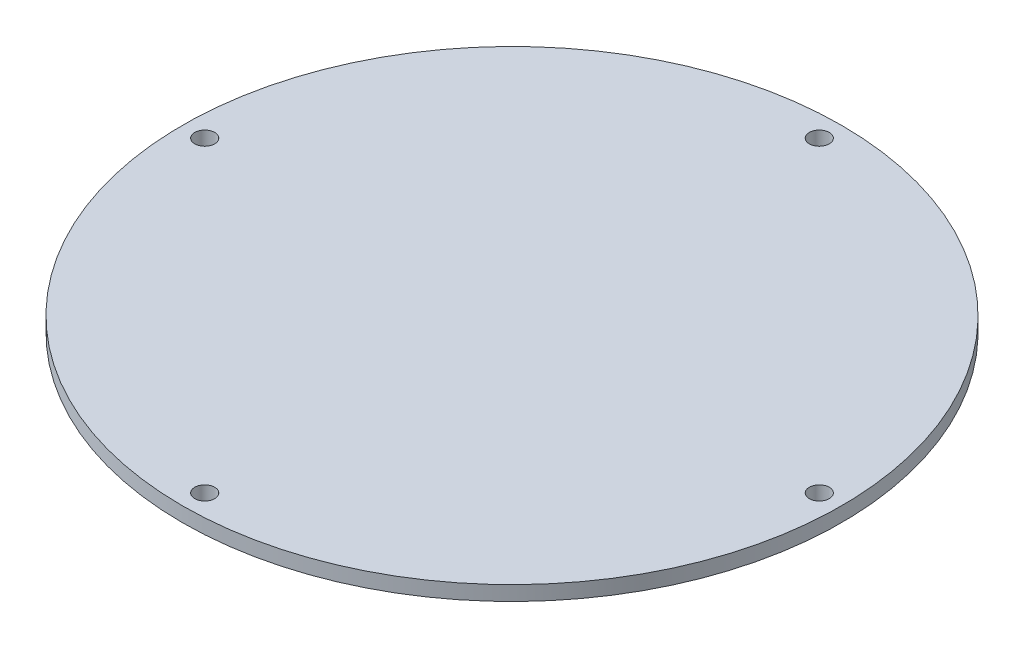
ISO-10303-21;
HEADER;
FILE_DESCRIPTION(('STEP AP214'),'2;1');
FILE_NAME('part.step','',(''),(''),'','','');
FILE_SCHEMA(('AUTOMOTIVE_DESIGN { 1 0 10303 214 1 1 1 1 }'));
ENDSEC;
DATA;
#1=APPLICATION_CONTEXT('core data for automotive mechanical design processes');
#2=APPLICATION_PROTOCOL_DEFINITION('international standard','automotive_design',2000,#1);
#3=PRODUCT_CONTEXT('',#1,'mechanical');
#4=PRODUCT('Part','Part','',(#3));
#5=PRODUCT_RELATED_PRODUCT_CATEGORY('part','',(#4));
#6=PRODUCT_DEFINITION_FORMATION('','',#4);
#7=PRODUCT_DEFINITION_CONTEXT('part definition',#1,'design');
#8=PRODUCT_DEFINITION('design','',#6,#7);
#9=PRODUCT_DEFINITION_SHAPE('','',#8);
#10=(LENGTH_UNIT() NAMED_UNIT(*) SI_UNIT(.MILLI.,.METRE.));
#11=(NAMED_UNIT(*) PLANE_ANGLE_UNIT() SI_UNIT($,.RADIAN.));
#12=(NAMED_UNIT(*) SI_UNIT($,.STERADIAN.) SOLID_ANGLE_UNIT());
#13=UNCERTAINTY_MEASURE_WITH_UNIT(LENGTH_MEASURE(1.E-05),#10,'distance_accuracy_value','');
#14=(GEOMETRIC_REPRESENTATION_CONTEXT(3) GLOBAL_UNCERTAINTY_ASSIGNED_CONTEXT((#13)) GLOBAL_UNIT_ASSIGNED_CONTEXT((#10,
#11,#12)) REPRESENTATION_CONTEXT('',''));
#15=CARTESIAN_POINT('',(0.,0.,0.));
#16=DIRECTION('',(0.,0.,1.));
#17=DIRECTION('',(1.,0.,0.));
#18=AXIS2_PLACEMENT_3D('',#15,#16,#17);
#19=CARTESIAN_POINT('',(0.,2.54,0.));
#20=DIRECTION('',(0.,-1.,0.));
#21=DIRECTION('',(0.,0.,-1.));
#22=AXIS2_PLACEMENT_3D('',#19,#20,#21);
#23=CYLINDRICAL_SURFACE('',#22,57.15);
#24=CARTESIAN_POINT('',(0.,2.54,0.));
#25=DIRECTION('',(0.,1.,0.));
#26=DIRECTION('',(0.,0.,1.));
#27=AXIS2_PLACEMENT_3D('',#24,#25,#26);
#28=CIRCLE('',#27,57.15);
#29=CARTESIAN_POINT('',(0.,2.54,57.15));
#30=VERTEX_POINT('',#29);
#31=EDGE_CURVE('E10',#30,#30,#28,.T.);
#32=ORIENTED_EDGE('',*,*,#31,.F.);
#33=EDGE_LOOP('',(#32));
#34=FACE_BOUND('',#33,.T.);
#35=CARTESIAN_POINT('',(0.,0.,0.));
#36=DIRECTION('',(0.,1.,0.));
#37=DIRECTION('',(0.,0.,1.));
#38=AXIS2_PLACEMENT_3D('',#35,#36,#37);
#39=CIRCLE('',#38,57.15);
#40=CARTESIAN_POINT('',(0.,0.,57.15));
#41=VERTEX_POINT('',#40);
#42=EDGE_CURVE('E54',#41,#41,#39,.T.);
#43=ORIENTED_EDGE('',*,*,#42,.T.);
#44=EDGE_LOOP('',(#43));
#45=FACE_BOUND('',#44,.T.);
#46=ADVANCED_FACE('F51',(#34,#45),#23,.T.);
#47=CARTESIAN_POINT('',(0.,2.54,0.));
#48=DIRECTION('',(0.,1.,0.));
#49=DIRECTION('',(0.,0.,1.));
#50=AXIS2_PLACEMENT_3D('',#47,#48,#49);
#51=PLANE('',#50);
#52=CARTESIAN_POINT('',(-5.58143949626649E-13,2.54,-53.286260229742));
#53=DIRECTION('',(0.,1.,0.));
#54=DIRECTION('',(0.,0.,1.));
#55=AXIS2_PLACEMENT_3D('',#52,#53,#54);
#56=CIRCLE('',#55,1.72719999999999);
#57=CARTESIAN_POINT('',(-5.58143949626649E-13,2.54,-51.559060229742));
#58=VERTEX_POINT('',#57);
#59=EDGE_CURVE('E83',#58,#58,#56,.T.);
#60=ORIENTED_EDGE('',*,*,#59,.F.);
#61=EDGE_LOOP('',(#60));
#62=FACE_BOUND('',#61,.T.);
#63=CARTESIAN_POINT('',(53.286260229742,2.54,0.));
#64=DIRECTION('',(0.,1.,0.));
#65=DIRECTION('',(0.,0.,1.));
#66=AXIS2_PLACEMENT_3D('',#63,#64,#65);
#67=CIRCLE('',#66,1.72719999999999);
#68=CARTESIAN_POINT('',(53.286260229742,2.54,1.72719999999999));
#69=VERTEX_POINT('',#68);
#70=EDGE_CURVE('E77',#69,#69,#67,.T.);
#71=ORIENTED_EDGE('',*,*,#70,.F.);
#72=EDGE_LOOP('',(#71));
#73=FACE_BOUND('',#72,.T.);
#74=CARTESIAN_POINT('',(1.86047983208883E-13,2.54,53.286260229742));
#75=DIRECTION('',(0.,1.,0.));
#76=DIRECTION('',(0.,0.,1.));
#77=AXIS2_PLACEMENT_3D('',#74,#75,#76);
#78=CIRCLE('',#77,1.72719999999999);
#79=CARTESIAN_POINT('',(1.86047983208883E-13,2.54,55.0134602297419));
#80=VERTEX_POINT('',#79);
#81=EDGE_CURVE('E71',#80,#80,#78,.T.);
#82=ORIENTED_EDGE('',*,*,#81,.F.);
#83=EDGE_LOOP('',(#82));
#84=FACE_BOUND('',#83,.T.);
#85=CARTESIAN_POINT('',(-53.286260229742,2.54,0.));
#86=DIRECTION('',(0.,1.,0.));
#87=DIRECTION('',(0.,0.,1.));
#88=AXIS2_PLACEMENT_3D('',#85,#86,#87);
#89=CIRCLE('',#88,1.72719999999999);
#90=CARTESIAN_POINT('',(-53.286260229742,2.54,1.72719999999999));
#91=VERTEX_POINT('',#90);
#92=EDGE_CURVE('E65',#91,#91,#89,.T.);
#93=ORIENTED_EDGE('',*,*,#92,.F.);
#94=EDGE_LOOP('',(#93));
#95=FACE_BOUND('',#94,.T.);
#96=ORIENTED_EDGE('',*,*,#31,.T.);
#97=EDGE_LOOP('',(#96));
#98=FACE_BOUND('',#97,.T.);
#99=ADVANCED_FACE('F89',(#62,#73,#84,#95,#98),#51,.T.);
#100=CARTESIAN_POINT('',(0.,0.,0.));
#101=DIRECTION('',(0.,1.,0.));
#102=DIRECTION('',(0.,0.,1.));
#103=AXIS2_PLACEMENT_3D('',#100,#101,#102);
#104=PLANE('',#103);
#105=CARTESIAN_POINT('',(-5.58143949626649E-13,0.,-53.286260229742));
#106=DIRECTION('',(0.,1.,0.));
#107=DIRECTION('',(0.,0.,1.));
#108=AXIS2_PLACEMENT_3D('',#105,#106,#107);
#109=CIRCLE('',#108,1.7272);
#110=CARTESIAN_POINT('',(-5.58143949626649E-13,0.,-51.559060229742));
#111=VERTEX_POINT('',#110);
#112=EDGE_CURVE('E80',#111,#111,#109,.T.);
#113=ORIENTED_EDGE('',*,*,#112,.T.);
#114=EDGE_LOOP('',(#113));
#115=FACE_BOUND('',#114,.T.);
#116=CARTESIAN_POINT('',(53.286260229742,0.,0.));
#117=DIRECTION('',(0.,1.,0.));
#118=DIRECTION('',(0.,0.,1.));
#119=AXIS2_PLACEMENT_3D('',#116,#117,#118);
#120=CIRCLE('',#119,1.7272);
#121=CARTESIAN_POINT('',(53.286260229742,0.,1.7272));
#122=VERTEX_POINT('',#121);
#123=EDGE_CURVE('E74',#122,#122,#120,.T.);
#124=ORIENTED_EDGE('',*,*,#123,.T.);
#125=EDGE_LOOP('',(#124));
#126=FACE_BOUND('',#125,.T.);
#127=CARTESIAN_POINT('',(1.86047983208883E-13,0.,53.286260229742));
#128=DIRECTION('',(0.,1.,0.));
#129=DIRECTION('',(0.,0.,1.));
#130=AXIS2_PLACEMENT_3D('',#127,#128,#129);
#131=CIRCLE('',#130,1.7272);
#132=CARTESIAN_POINT('',(1.86047983208883E-13,0.,55.013460229742));
#133=VERTEX_POINT('',#132);
#134=EDGE_CURVE('E68',#133,#133,#131,.T.);
#135=ORIENTED_EDGE('',*,*,#134,.T.);
#136=EDGE_LOOP('',(#135));
#137=FACE_BOUND('',#136,.T.);
#138=CARTESIAN_POINT('',(-53.286260229742,0.,0.));
#139=DIRECTION('',(0.,1.,0.));
#140=DIRECTION('',(0.,0.,1.));
#141=AXIS2_PLACEMENT_3D('',#138,#139,#140);
#142=CIRCLE('',#141,1.7272);
#143=CARTESIAN_POINT('',(-53.286260229742,0.,1.7272));
#144=VERTEX_POINT('',#143);
#145=EDGE_CURVE('E61',#144,#144,#142,.T.);
#146=ORIENTED_EDGE('',*,*,#145,.T.);
#147=EDGE_LOOP('',(#146));
#148=FACE_BOUND('',#147,.T.);
#149=ORIENTED_EDGE('',*,*,#42,.F.);
#150=EDGE_LOOP('',(#149));
#151=FACE_BOUND('',#150,.T.);
#152=ADVANCED_FACE('F92',(#115,#126,#137,#148,#151),#104,.F.);
#153=CARTESIAN_POINT('',(-53.286260229742,2.54,0.));
#154=DIRECTION('',(0.,1.,0.));
#155=DIRECTION('',(0.,0.,1.));
#156=AXIS2_PLACEMENT_3D('',#153,#154,#155);
#157=CYLINDRICAL_SURFACE('',#156,1.72719999999999);
#158=ORIENTED_EDGE('',*,*,#145,.F.);
#159=EDGE_LOOP('',(#158));
#160=FACE_BOUND('',#159,.T.);
#161=ORIENTED_EDGE('',*,*,#92,.T.);
#162=EDGE_LOOP('',(#161));
#163=FACE_BOUND('',#162,.T.);
#164=ADVANCED_FACE('F100',(#160,#163),#157,.F.);
#165=CARTESIAN_POINT('',(1.86047983208883E-13,2.54,53.286260229742));
#166=DIRECTION('',(0.,1.,0.));
#167=DIRECTION('',(0.,0.,1.));
#168=AXIS2_PLACEMENT_3D('',#165,#166,#167);
#169=CYLINDRICAL_SURFACE('',#168,1.72719999999999);
#170=ORIENTED_EDGE('',*,*,#134,.F.);
#171=EDGE_LOOP('',(#170));
#172=FACE_BOUND('',#171,.T.);
#173=ORIENTED_EDGE('',*,*,#81,.T.);
#174=EDGE_LOOP('',(#173));
#175=FACE_BOUND('',#174,.T.);
#176=ADVANCED_FACE('F102',(#172,#175),#169,.F.);
#177=CARTESIAN_POINT('',(53.286260229742,2.54,0.));
#178=DIRECTION('',(0.,1.,0.));
#179=DIRECTION('',(0.,0.,1.));
#180=AXIS2_PLACEMENT_3D('',#177,#178,#179);
#181=CYLINDRICAL_SURFACE('',#180,1.72719999999999);
#182=ORIENTED_EDGE('',*,*,#123,.F.);
#183=EDGE_LOOP('',(#182));
#184=FACE_BOUND('',#183,.T.);
#185=ORIENTED_EDGE('',*,*,#70,.T.);
#186=EDGE_LOOP('',(#185));
#187=FACE_BOUND('',#186,.T.);
#188=ADVANCED_FACE('F108',(#184,#187),#181,.F.);
#189=CARTESIAN_POINT('',(-5.58143949626649E-13,2.54,-53.286260229742));
#190=DIRECTION('',(0.,1.,0.));
#191=DIRECTION('',(0.,0.,1.));
#192=AXIS2_PLACEMENT_3D('',#189,#190,#191);
#193=CYLINDRICAL_SURFACE('',#192,1.72719999999999);
#194=ORIENTED_EDGE('',*,*,#112,.F.);
#195=EDGE_LOOP('',(#194));
#196=FACE_BOUND('',#195,.T.);
#197=ORIENTED_EDGE('',*,*,#59,.T.);
#198=EDGE_LOOP('',(#197));
#199=FACE_BOUND('',#198,.T.);
#200=ADVANCED_FACE('F87',(#196,#199),#193,.F.);
#201=CLOSED_SHELL('',(#46,#99,#152,#164,#176,#188,#200));
#202=MANIFOLD_SOLID_BREP('B2',#201);
#203=ADVANCED_BREP_SHAPE_REPRESENTATION('',(#18,#202),#14);
#204=SHAPE_DEFINITION_REPRESENTATION(#9,#203);
ENDSEC;
END-ISO-10303-21;
